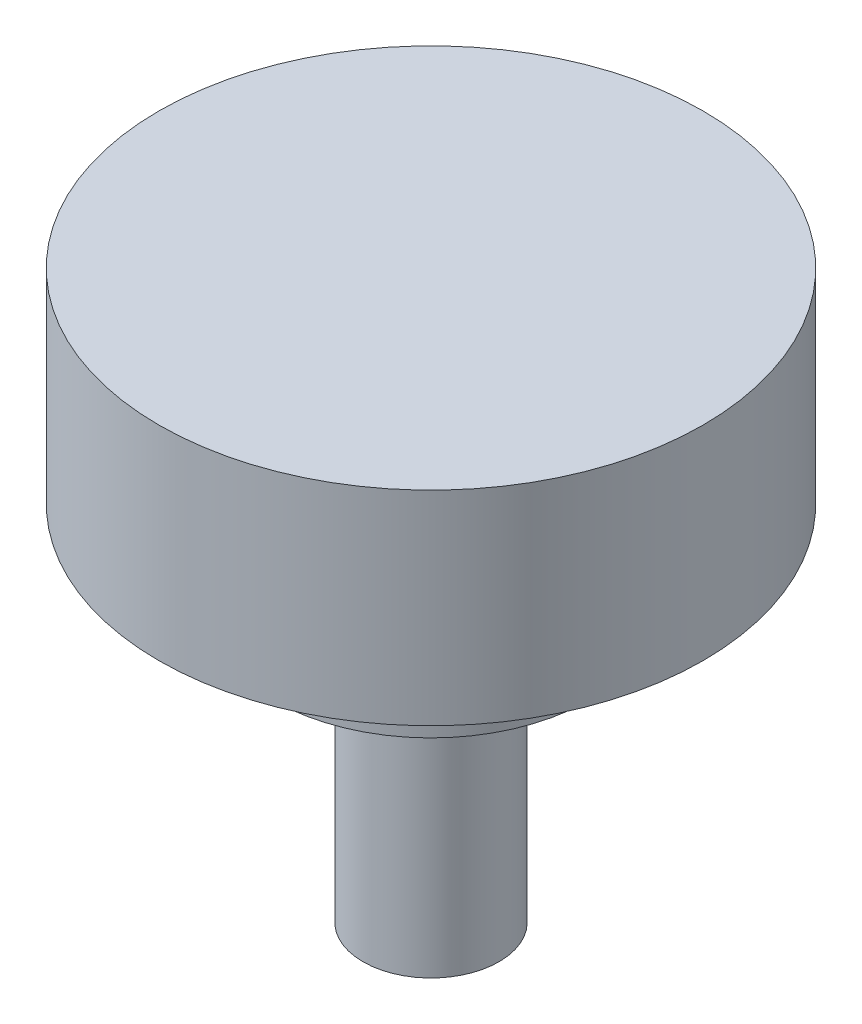
ISO-10303-21;
HEADER;
FILE_DESCRIPTION(('STEP AP214'),'2;1');
FILE_NAME('part.step','',(''),(''),'','','');
FILE_SCHEMA(('AUTOMOTIVE_DESIGN { 1 0 10303 214 1 1 1 1 }'));
ENDSEC;
DATA;
#1=APPLICATION_CONTEXT('core data for automotive mechanical design processes');
#2=APPLICATION_PROTOCOL_DEFINITION('international standard','automotive_design',2000,#1);
#3=PRODUCT_CONTEXT('',#1,'mechanical');
#4=PRODUCT('Part','Part','',(#3));
#5=PRODUCT_RELATED_PRODUCT_CATEGORY('part','',(#4));
#6=PRODUCT_DEFINITION_FORMATION('','',#4);
#7=PRODUCT_DEFINITION_CONTEXT('part definition',#1,'design');
#8=PRODUCT_DEFINITION('design','',#6,#7);
#9=PRODUCT_DEFINITION_SHAPE('','',#8);
#10=(LENGTH_UNIT() NAMED_UNIT(*) SI_UNIT(.MILLI.,.METRE.));
#11=(NAMED_UNIT(*) PLANE_ANGLE_UNIT() SI_UNIT($,.RADIAN.));
#12=(NAMED_UNIT(*) SI_UNIT($,.STERADIAN.) SOLID_ANGLE_UNIT());
#13=UNCERTAINTY_MEASURE_WITH_UNIT(LENGTH_MEASURE(1.E-05),#10,'distance_accuracy_value','');
#14=(GEOMETRIC_REPRESENTATION_CONTEXT(3) GLOBAL_UNCERTAINTY_ASSIGNED_CONTEXT((#13)) GLOBAL_UNIT_ASSIGNED_CONTEXT((#10,
#11,#12)) REPRESENTATION_CONTEXT('',''));
#15=CARTESIAN_POINT('',(0.,0.,0.));
#16=DIRECTION('',(0.,0.,1.));
#17=DIRECTION('',(1.,0.,0.));
#18=AXIS2_PLACEMENT_3D('',#15,#16,#17);
#19=CARTESIAN_POINT('',(0.,12.,0.));
#20=DIRECTION('',(0.,-1.,0.));
#21=DIRECTION('',(0.,0.,-1.));
#22=AXIS2_PLACEMENT_3D('',#19,#20,#21);
#23=CYLINDRICAL_SURFACE('',#22,3.);
#24=CARTESIAN_POINT('',(0.,12.,0.));
#25=DIRECTION('',(0.,1.,0.));
#26=DIRECTION('',(0.,0.,1.));
#27=AXIS2_PLACEMENT_3D('',#24,#25,#26);
#28=CIRCLE('',#27,3.);
#29=CARTESIAN_POINT('',(0.,12.,3.00000000000003));
#30=VERTEX_POINT('',#29);
#31=EDGE_CURVE('E10',#30,#30,#28,.T.);
#32=ORIENTED_EDGE('',*,*,#31,.F.);
#33=EDGE_LOOP('',(#32));
#34=FACE_BOUND('',#33,.T.);
#35=CARTESIAN_POINT('',(0.,0.,0.));
#36=DIRECTION('',(0.,1.,0.));
#37=DIRECTION('',(0.,0.,1.));
#38=AXIS2_PLACEMENT_3D('',#35,#36,#37);
#39=CIRCLE('',#38,3.);
#40=CARTESIAN_POINT('',(0.,0.,3.));
#41=VERTEX_POINT('',#40);
#42=EDGE_CURVE('E33',#41,#41,#39,.T.);
#43=ORIENTED_EDGE('',*,*,#42,.T.);
#44=EDGE_LOOP('',(#43));
#45=FACE_BOUND('',#44,.T.);
#46=ADVANCED_FACE('F30',(#34,#45),#23,.T.);
#47=CARTESIAN_POINT('',(0.,0.,0.));
#48=DIRECTION('',(0.,1.,0.));
#49=DIRECTION('',(0.,0.,1.));
#50=AXIS2_PLACEMENT_3D('',#47,#48,#49);
#51=PLANE('',#50);
#52=ORIENTED_EDGE('',*,*,#42,.F.);
#53=EDGE_LOOP('',(#52));
#54=FACE_BOUND('',#53,.T.);
#55=ADVANCED_FACE('F72',(#54),#51,.F.);
#56=CARTESIAN_POINT('',(0.,16.,0.));
#57=DIRECTION('',(0.,-1.,0.));
#58=DIRECTION('',(0.,0.,-1.));
#59=AXIS2_PLACEMENT_3D('',#56,#57,#58);
#60=CYLINDRICAL_SURFACE('',#59,7.);
#61=CARTESIAN_POINT('',(0.,16.,0.));
#62=DIRECTION('',(0.,1.,0.));
#63=DIRECTION('',(0.,0.,1.));
#64=AXIS2_PLACEMENT_3D('',#61,#62,#63);
#65=CIRCLE('',#64,7.);
#66=CARTESIAN_POINT('',(0.,16.,7.00000000000001));
#67=VERTEX_POINT('',#66);
#68=EDGE_CURVE('E40',#67,#67,#65,.T.);
#69=ORIENTED_EDGE('',*,*,#68,.F.);
#70=EDGE_LOOP('',(#69));
#71=FACE_BOUND('',#70,.T.);
#72=CARTESIAN_POINT('',(0.,12.,0.));
#73=DIRECTION('',(0.,1.,0.));
#74=DIRECTION('',(0.,0.,1.));
#75=AXIS2_PLACEMENT_3D('',#72,#73,#74);
#76=CIRCLE('',#75,7.);
#77=CARTESIAN_POINT('',(0.,12.,7.00000000000004));
#78=VERTEX_POINT('',#77);
#79=EDGE_CURVE('E42',#78,#78,#76,.T.);
#80=ORIENTED_EDGE('',*,*,#79,.T.);
#81=EDGE_LOOP('',(#80));
#82=FACE_BOUND('',#81,.T.);
#83=ADVANCED_FACE('F77',(#71,#82),#60,.T.);
#84=CARTESIAN_POINT('',(0.,12.,0.));
#85=DIRECTION('',(0.,1.,0.));
#86=DIRECTION('',(0.,0.,1.));
#87=AXIS2_PLACEMENT_3D('',#84,#85,#86);
#88=PLANE('',#87);
#89=ORIENTED_EDGE('',*,*,#31,.T.);
#90=EDGE_LOOP('',(#89));
#91=FACE_BOUND('',#90,.T.);
#92=ORIENTED_EDGE('',*,*,#79,.F.);
#93=EDGE_LOOP('',(#92));
#94=FACE_BOUND('',#93,.T.);
#95=ADVANCED_FACE('F59',(#91,#94),#88,.F.);
#96=CARTESIAN_POINT('',(0.,25.,0.));
#97=DIRECTION('',(0.,-1.,0.));
#98=DIRECTION('',(0.,0.,-1.));
#99=AXIS2_PLACEMENT_3D('',#96,#97,#98);
#100=CYLINDRICAL_SURFACE('',#99,12.);
#101=CARTESIAN_POINT('',(0.,25.,0.));
#102=DIRECTION('',(0.,1.,0.));
#103=DIRECTION('',(0.,0.,1.));
#104=AXIS2_PLACEMENT_3D('',#101,#102,#103);
#105=CIRCLE('',#104,12.);
#106=CARTESIAN_POINT('',(0.,25.,12.));
#107=VERTEX_POINT('',#106);
#108=EDGE_CURVE('E45',#107,#107,#105,.T.);
#109=ORIENTED_EDGE('',*,*,#108,.F.);
#110=EDGE_LOOP('',(#109));
#111=FACE_BOUND('',#110,.T.);
#112=CARTESIAN_POINT('',(0.,16.,0.));
#113=DIRECTION('',(0.,1.,0.));
#114=DIRECTION('',(0.,0.,1.));
#115=AXIS2_PLACEMENT_3D('',#112,#113,#114);
#116=CIRCLE('',#115,12.);
#117=CARTESIAN_POINT('',(0.,16.,12.));
#118=VERTEX_POINT('',#117);
#119=EDGE_CURVE('E48',#118,#118,#116,.T.);
#120=ORIENTED_EDGE('',*,*,#119,.T.);
#121=EDGE_LOOP('',(#120));
#122=FACE_BOUND('',#121,.T.);
#123=ADVANCED_FACE('F56',(#111,#122),#100,.T.);
#124=CARTESIAN_POINT('',(0.,25.,0.));
#125=DIRECTION('',(0.,1.,0.));
#126=DIRECTION('',(0.,0.,1.));
#127=AXIS2_PLACEMENT_3D('',#124,#125,#126);
#128=PLANE('',#127);
#129=ORIENTED_EDGE('',*,*,#108,.T.);
#130=EDGE_LOOP('',(#129));
#131=FACE_BOUND('',#130,.T.);
#132=ADVANCED_FACE('F54',(#131),#128,.T.);
#133=CARTESIAN_POINT('',(0.,16.,0.));
#134=DIRECTION('',(0.,1.,0.));
#135=DIRECTION('',(0.,0.,1.));
#136=AXIS2_PLACEMENT_3D('',#133,#134,#135);
#137=PLANE('',#136);
#138=ORIENTED_EDGE('',*,*,#68,.T.);
#139=EDGE_LOOP('',(#138));
#140=FACE_BOUND('',#139,.T.);
#141=ORIENTED_EDGE('',*,*,#119,.F.);
#142=EDGE_LOOP('',(#141));
#143=FACE_BOUND('',#142,.T.);
#144=ADVANCED_FACE('F63',(#140,#143),#137,.F.);
#145=CLOSED_SHELL('',(#46,#55,#83,#95,#123,#132,#144));
#146=MANIFOLD_SOLID_BREP('B2',#145);
#147=ADVANCED_BREP_SHAPE_REPRESENTATION('',(#18,#146),#14);
#148=SHAPE_DEFINITION_REPRESENTATION(#9,#147);
ENDSEC;
END-ISO-10303-21;
